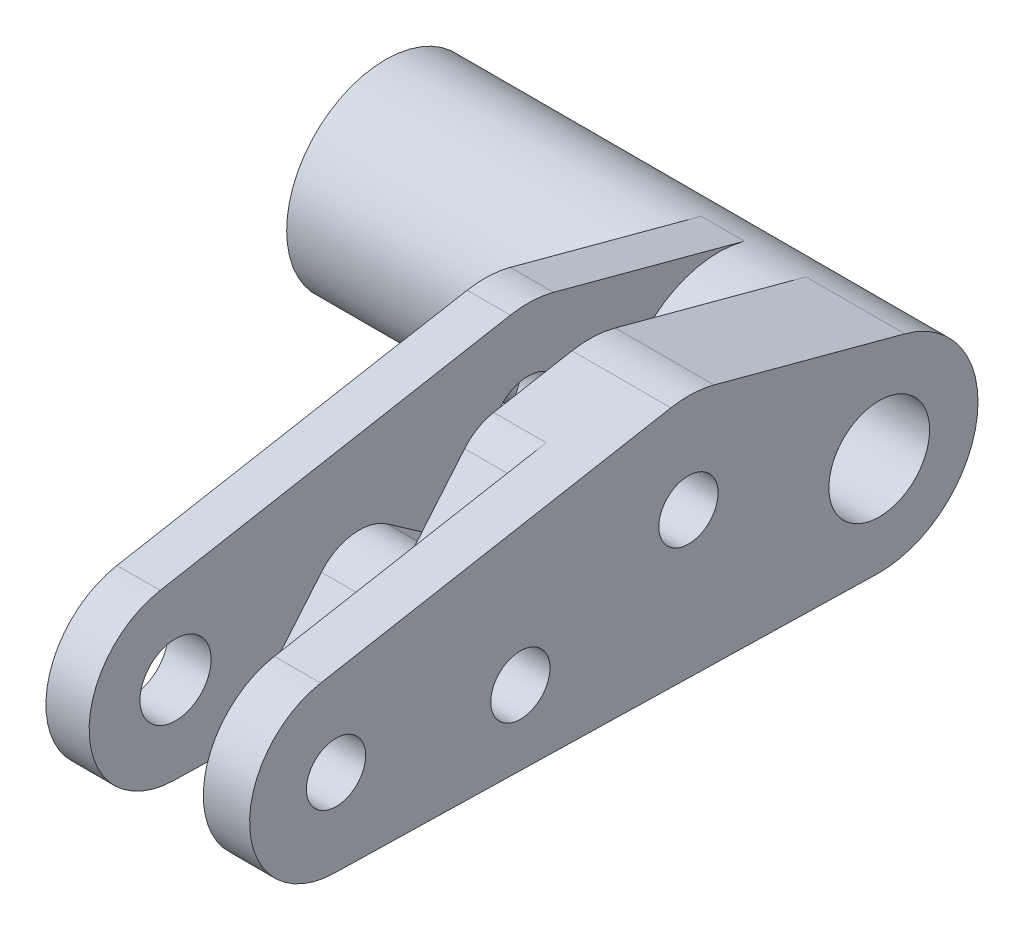
ISO-10303-21;
HEADER;
FILE_DESCRIPTION(('STEP AP214'),'2;1');
FILE_NAME('part.step','',(''),(''),'','','');
FILE_SCHEMA(('AUTOMOTIVE_DESIGN { 1 0 10303 214 1 1 1 1 }'));
ENDSEC;
DATA;
#1=APPLICATION_CONTEXT('core data for automotive mechanical design processes');
#2=APPLICATION_PROTOCOL_DEFINITION('international standard','automotive_design',2000,#1);
#3=PRODUCT_CONTEXT('',#1,'mechanical');
#4=PRODUCT('Part','Part','',(#3));
#5=PRODUCT_RELATED_PRODUCT_CATEGORY('part','',(#4));
#6=PRODUCT_DEFINITION_FORMATION('','',#4);
#7=PRODUCT_DEFINITION_CONTEXT('part definition',#1,'design');
#8=PRODUCT_DEFINITION('design','',#6,#7);
#9=PRODUCT_DEFINITION_SHAPE('','',#8);
#10=(LENGTH_UNIT() NAMED_UNIT(*) SI_UNIT(.MILLI.,.METRE.));
#11=(NAMED_UNIT(*) PLANE_ANGLE_UNIT() SI_UNIT($,.RADIAN.));
#12=(NAMED_UNIT(*) SI_UNIT($,.STERADIAN.) SOLID_ANGLE_UNIT());
#13=UNCERTAINTY_MEASURE_WITH_UNIT(LENGTH_MEASURE(1.E-05),#10,'distance_accuracy_value','');
#14=(GEOMETRIC_REPRESENTATION_CONTEXT(3) GLOBAL_UNCERTAINTY_ASSIGNED_CONTEXT((#13)) GLOBAL_UNIT_ASSIGNED_CONTEXT((#10,
#11,#12)) REPRESENTATION_CONTEXT('',''));
#15=CARTESIAN_POINT('',(0.,0.,0.));
#16=DIRECTION('',(0.,0.,1.));
#17=DIRECTION('',(1.,0.,0.));
#18=AXIS2_PLACEMENT_3D('',#15,#16,#17);
#19=CARTESIAN_POINT('',(-13.096875,-6.34835980883225,0.144318181818181));
#20=DIRECTION('',(0.,-0.999741702178308,0.0227272727272727));
#21=DIRECTION('',(0.,-0.0227272727272727,-0.999741702178308));
#22=AXIS2_PLACEMENT_3D('',#19,#20,#21);
#23=PLANE('',#22);
#24=DIRECTION('',(0.,-0.022727272727273,-0.999741702178308));
#25=VECTOR('',#24,1.);
#26=CARTESIAN_POINT('',(-2.9765625,-5.55481483272822,35.0512784090909));
#27=LINE('',#26,#25);
#28=CARTESIAN_POINT('',(-2.9765625,-5.55481483272822,35.0512784090909));
#29=VERTEX_POINT('',#28);
#30=CARTESIAN_POINT('',(-2.9765625,-5.62468257207032,31.9778919321734));
#31=VERTEX_POINT('',#30);
#32=EDGE_CURVE('E245',#29,#31,#27,.T.);
#33=ORIENTED_EDGE('',*,*,#32,.T.);
#34=DIRECTION('',(1.,0.,0.));
#35=VECTOR('',#34,1.);
#36=CARTESIAN_POINT('',(-10.31875,-5.62468257207032,31.9778919321734));
#37=LINE('',#36,#35);
#38=CARTESIAN_POINT('',(-10.31875,-5.62468257207032,31.9778919321734));
#39=VERTEX_POINT('',#38);
#40=EDGE_CURVE('E273',#39,#31,#37,.T.);
#41=ORIENTED_EDGE('',*,*,#40,.F.);
#42=DIRECTION('',(0.,-0.022727272727273,-0.999741702178308));
#43=VECTOR('',#42,1.);
#44=CARTESIAN_POINT('',(-10.31875,-5.55481483272822,35.0512784090909));
#45=LINE('',#44,#43);
#46=CARTESIAN_POINT('',(-10.31875,-5.55481483272822,35.0512784090909));
#47=VERTEX_POINT('',#46);
#48=EDGE_CURVE('E259',#47,#39,#45,.T.);
#49=ORIENTED_EDGE('',*,*,#48,.F.);
#50=DIRECTION('',(1.,0.,0.));
#51=VECTOR('',#50,1.);
#52=CARTESIAN_POINT('',(-13.096875,-5.55481483272822,35.0512784090909));
#53=LINE('',#52,#51);
#54=CARTESIAN_POINT('',(-13.096875,-5.55481483272822,35.0512784090909));
#55=VERTEX_POINT('',#54);
#56=EDGE_CURVE('E323',#55,#47,#53,.T.);
#57=ORIENTED_EDGE('',*,*,#56,.F.);
#58=DIRECTION('',(0.,-0.0227272727272727,-0.999741702178308));
#59=VECTOR('',#58,1.);
#60=CARTESIAN_POINT('',(-13.096875,-6.34835980883225,0.144318181818181));
#61=LINE('',#60,#59);
#62=CARTESIAN_POINT('',(-13.096875,-6.34835980883225,0.144318181818181));
#63=VERTEX_POINT('',#62);
#64=EDGE_CURVE('E304',#55,#63,#61,.T.);
#65=ORIENTED_EDGE('',*,*,#64,.T.);
#66=DIRECTION('',(1.,0.,0.));
#67=VECTOR('',#66,1.);
#68=CARTESIAN_POINT('',(-13.096875,-6.34835980883225,0.144318181818181));
#69=LINE('',#68,#67);
#70=CARTESIAN_POINT('',(0.,-6.34835980883225,0.144318181818181));
#71=VERTEX_POINT('',#70);
#72=EDGE_CURVE('E199',#63,#71,#69,.T.);
#73=ORIENTED_EDGE('',*,*,#72,.T.);
#74=DIRECTION('',(0.,-0.0227272727272727,-0.999741702178308));
#75=VECTOR('',#74,1.);
#76=CARTESIAN_POINT('',(0.,-6.34835980883225,0.144318181818181));
#77=LINE('',#76,#75);
#78=CARTESIAN_POINT('',(0.,-5.55481483272822,35.0512784090909));
#79=VERTEX_POINT('',#78);
#80=EDGE_CURVE('E184',#79,#71,#77,.T.);
#81=ORIENTED_EDGE('',*,*,#80,.F.);
#82=EDGE_CURVE('E326',#29,#79,#53,.T.);
#83=ORIENTED_EDGE('',*,*,#82,.F.);
#84=EDGE_LOOP('',(#33,#41,#49,#57,#65,#73,#81,#83));
#85=FACE_BOUND('',#84,.T.);
#86=ADVANCED_FACE('F41',(#85),#23,.T.);
#87=CARTESIAN_POINT('',(-13.096875,0.,34.925));
#88=DIRECTION('',(1.,0.,0.));
#89=DIRECTION('',(0.,0.,-1.));
#90=AXIS2_PLACEMENT_3D('',#87,#88,#89);
#91=CYLINDRICAL_SURFACE('',#90,5.55625);
#92=ORIENTED_EDGE('',*,*,#56,.T.);
#93=CARTESIAN_POINT('',(-10.31875,0.,34.925));
#94=DIRECTION('',(1.,0.,0.));
#95=DIRECTION('',(0.,0.,-1.));
#96=AXIS2_PLACEMENT_3D('',#93,#94,#95);
#97=CIRCLE('',#96,5.55625);
#98=CARTESIAN_POINT('',(-10.31875,5.46772752838044,35.9128611936354));
#99=VERTEX_POINT('',#98);
#100=EDGE_CURVE('E257',#99,#47,#97,.T.);
#101=ORIENTED_EDGE('',*,*,#100,.F.);
#102=DIRECTION('',(1.,0.,0.));
#103=VECTOR('',#102,1.);
#104=CARTESIAN_POINT('',(-13.096875,5.46772752838044,35.9128611936354));
#105=LINE('',#104,#103);
#106=CARTESIAN_POINT('',(-13.096875,5.46772752838044,35.9128611936354));
#107=VERTEX_POINT('',#106);
#108=EDGE_CURVE('E327',#107,#99,#105,.T.);
#109=ORIENTED_EDGE('',*,*,#108,.F.);
#110=CARTESIAN_POINT('',(-13.096875,0.,34.925));
#111=DIRECTION('',(1.,0.,0.));
#112=DIRECTION('',(0.,0.,1.));
#113=AXIS2_PLACEMENT_3D('',#110,#111,#112);
#114=CIRCLE('',#113,5.55625);
#115=EDGE_CURVE('E301',#107,#55,#114,.T.);
#116=ORIENTED_EDGE('',*,*,#115,.T.);
#117=EDGE_LOOP('',(#92,#101,#109,#116));
#118=FACE_BOUND('',#117,.T.);
#119=ADVANCED_FACE('F398',(#118),#91,.T.);
#120=CARTESIAN_POINT('',(-13.096875,5.46772752838044,35.9128611936354));
#121=DIRECTION('',(0.,0.984067946615152,0.177792790755526));
#122=DIRECTION('',(0.,-0.177792790755526,0.984067946615152));
#123=AXIS2_PLACEMENT_3D('',#120,#121,#122);
#124=PLANE('',#123);
#125=ORIENTED_EDGE('',*,*,#108,.T.);
#126=DIRECTION('',(0.,-0.177792790755526,0.984067946615152));
#127=VECTOR('',#126,1.);
#128=CARTESIAN_POINT('',(-10.31875,9.53583333380815,13.3962422151688));
#129=LINE('',#128,#127);
#130=CARTESIAN_POINT('',(-10.31875,9.53583333380815,13.3962422151688));
#131=VERTEX_POINT('',#130);
#132=EDGE_CURVE('E255',#131,#99,#129,.T.);
#133=ORIENTED_EDGE('',*,*,#132,.F.);
#134=DIRECTION('',(1.,0.,0.));
#135=VECTOR('',#134,1.);
#136=CARTESIAN_POINT('',(-13.096875,9.53583333380815,13.3962422151688));
#137=LINE('',#136,#135);
#138=CARTESIAN_POINT('',(-13.096875,9.53583333380815,13.3962422151688));
#139=VERTEX_POINT('',#138);
#140=EDGE_CURVE('E331',#139,#131,#137,.T.);
#141=ORIENTED_EDGE('',*,*,#140,.F.);
#142=DIRECTION('',(0.,-0.177792790755526,0.984067946615152));
#143=VECTOR('',#142,1.);
#144=CARTESIAN_POINT('',(-13.096875,5.46772752838044,35.9128611936354));
#145=LINE('',#144,#143);
#146=EDGE_CURVE('E298',#139,#107,#145,.T.);
#147=ORIENTED_EDGE('',*,*,#146,.T.);
#148=EDGE_LOOP('',(#125,#133,#141,#147));
#149=FACE_BOUND('',#148,.T.);
#150=ADVANCED_FACE('F393',(#149),#124,.T.);
#151=CARTESIAN_POINT('',(-13.096875,3.28700187280193,12.2672579938712));
#152=DIRECTION('',(1.,0.,0.));
#153=DIRECTION('',(0.,0.,-1.));
#154=AXIS2_PLACEMENT_3D('',#151,#152,#153);
#155=CYLINDRICAL_SURFACE('',#154,6.35);
#156=ORIENTED_EDGE('',*,*,#140,.T.);
#157=CARTESIAN_POINT('',(-10.31875,3.28700187280193,12.2672579938712));
#158=DIRECTION('',(1.,0.,0.));
#159=DIRECTION('',(0.,0.,-1.));
#160=AXIS2_PLACEMENT_3D('',#157,#158,#159);
#161=CIRCLE('',#160,6.35);
#162=CARTESIAN_POINT('',(-10.31875,9.42063086973753,10.6237570574702));
#163=VERTEX_POINT('',#162);
#164=EDGE_CURVE('E253',#163,#131,#161,.T.);
#165=ORIENTED_EDGE('',*,*,#164,.F.);
#166=DIRECTION('',(1.,0.,0.));
#167=VECTOR('',#166,1.);
#168=CARTESIAN_POINT('',(-13.096875,9.42063086973753,10.6237570574702));
#169=LINE('',#168,#167);
#170=CARTESIAN_POINT('',(-13.096875,9.42063086973753,10.6237570574702));
#171=VERTEX_POINT('',#170);
#172=EDGE_CURVE('E335',#171,#163,#169,.T.);
#173=ORIENTED_EDGE('',*,*,#172,.F.);
#174=CARTESIAN_POINT('',(-13.096875,3.28700187280193,12.2672579938712));
#175=DIRECTION('',(1.,0.,0.));
#176=DIRECTION('',(0.,0.,1.));
#177=AXIS2_PLACEMENT_3D('',#174,#175,#176);
#178=CIRCLE('',#177,6.35);
#179=EDGE_CURVE('E181',#171,#139,#178,.T.);
#180=ORIENTED_EDGE('',*,*,#179,.T.);
#181=EDGE_LOOP('',(#156,#165,#173,#180));
#182=FACE_BOUND('',#181,.T.);
#183=ADVANCED_FACE('F396',(#182),#155,.T.);
#184=CARTESIAN_POINT('',(-13.096875,9.42063086973753,10.6237570574702));
#185=DIRECTION('',(0.,0.96592582628907,-0.258819045102514));
#186=DIRECTION('',(0.,0.258819045102514,0.96592582628907));
#187=AXIS2_PLACEMENT_3D('',#184,#185,#186);
#188=PLANE('',#187);
#189=ORIENTED_EDGE('',*,*,#172,.T.);
#190=DIRECTION('',(0.,0.258819045102514,0.96592582628907));
#191=VECTOR('',#190,1.);
#192=CARTESIAN_POINT('',(-10.31875,6.1336289969356,-1.64350093640097));
#193=LINE('',#192,#191);
#194=CARTESIAN_POINT('',(-10.31875,6.1336289969356,-1.64350093640097));
#195=VERTEX_POINT('',#194);
#196=EDGE_CURVE('E190',#195,#163,#193,.T.);
#197=ORIENTED_EDGE('',*,*,#196,.F.);
#198=DIRECTION('',(1.,0.,0.));
#199=VECTOR('',#198,1.);
#200=CARTESIAN_POINT('',(-13.096875,6.1336289969356,-1.64350093640097));
#201=LINE('',#200,#199);
#202=CARTESIAN_POINT('',(-13.096875,6.13362899693559,-1.64350093640097));
#203=VERTEX_POINT('',#202);
#204=EDGE_CURVE('E188',#203,#195,#201,.T.);
#205=ORIENTED_EDGE('',*,*,#204,.F.);
#206=DIRECTION('',(0.,0.258819045102514,0.96592582628907));
#207=VECTOR('',#206,1.);
#208=CARTESIAN_POINT('',(-13.096875,9.42063086973753,10.6237570574702));
#209=LINE('',#208,#207);
#210=EDGE_CURVE('E172',#203,#171,#209,.T.);
#211=ORIENTED_EDGE('',*,*,#210,.T.);
#212=EDGE_LOOP('',(#189,#197,#205,#211));
#213=FACE_BOUND('',#212,.T.);
#214=ADVANCED_FACE('F189',(#213),#188,.T.);
#215=CARTESIAN_POINT('',(-13.096875,0.,0.));
#216=DIRECTION('',(1.,0.,0.));
#217=DIRECTION('',(0.,0.,-1.));
#218=AXIS2_PLACEMENT_3D('',#215,#216,#217);
#219=CYLINDRICAL_SURFACE('',#218,6.35);
#220=CARTESIAN_POINT('',(0.,0.,0.));
#221=DIRECTION('',(1.,0.,0.));
#222=DIRECTION('',(0.,0.,-1.));
#223=AXIS2_PLACEMENT_3D('',#220,#221,#222);
#224=CIRCLE('',#223,6.35);
#225=CARTESIAN_POINT('',(0.,6.1336289969356,-1.64350093640097));
#226=VERTEX_POINT('',#225);
#227=EDGE_CURVE('E290',#71,#226,#224,.T.);
#228=ORIENTED_EDGE('',*,*,#227,.F.);
#229=ORIENTED_EDGE('',*,*,#72,.F.);
#230=CARTESIAN_POINT('',(-13.096875,0.,0.));
#231=DIRECTION('',(-1.,0.,0.));
#232=DIRECTION('',(0.,0.,1.));
#233=AXIS2_PLACEMENT_3D('',#230,#231,#232);
#234=CIRCLE('',#233,6.35);
#235=EDGE_CURVE('E177',#63,#203,#234,.T.);
#236=ORIENTED_EDGE('',*,*,#235,.T.);
#237=ORIENTED_EDGE('',*,*,#204,.T.);
#238=CARTESIAN_POINT('',(-10.31875,0.,0.));
#239=DIRECTION('',(-1.,0.,0.));
#240=DIRECTION('',(0.,0.,-1.));
#241=AXIS2_PLACEMENT_3D('',#238,#239,#240);
#242=CIRCLE('',#241,6.35);
#243=CARTESIAN_POINT('',(-10.31875,1.64350093640097,6.1336289969356));
#244=VERTEX_POINT('',#243);
#245=EDGE_CURVE('E249',#244,#195,#242,.T.);
#246=ORIENTED_EDGE('',*,*,#245,.F.);
#247=DIRECTION('',(1.,0.,0.));
#248=VECTOR('',#247,1.);
#249=CARTESIAN_POINT('',(-10.31875,1.64350093640097,6.1336289969356));
#250=LINE('',#249,#248);
#251=CARTESIAN_POINT('',(-6.35,1.64350093640097,6.1336289969356));
#252=VERTEX_POINT('',#251);
#253=EDGE_CURVE('E288',#244,#252,#250,.T.);
#254=ORIENTED_EDGE('',*,*,#253,.T.);
#255=CARTESIAN_POINT('',(-6.35,0.,0.));
#256=DIRECTION('',(-1.,0.,0.));
#257=DIRECTION('',(0.,0.,-1.));
#258=AXIS2_PLACEMENT_3D('',#255,#256,#257);
#259=CIRCLE('',#258,6.35);
#260=CARTESIAN_POINT('',(-6.35,6.1336289969356,-1.64350093640097));
#261=VERTEX_POINT('',#260);
#262=EDGE_CURVE('E248',#252,#261,#259,.T.);
#263=ORIENTED_EDGE('',*,*,#262,.T.);
#264=EDGE_CURVE('E194',#261,#226,#201,.T.);
#265=ORIENTED_EDGE('',*,*,#264,.T.);
#266=EDGE_LOOP('',(#228,#229,#236,#237,#246,#254,#263,#265));
#267=FACE_BOUND('',#266,.T.);
#268=CARTESIAN_POINT('',(-31.75,0.,0.));
#269=DIRECTION('',(1.,0.,0.));
#270=DIRECTION('',(0.,0.,-1.));
#271=AXIS2_PLACEMENT_3D('',#268,#269,#270);
#272=CIRCLE('',#271,6.35);
#273=CARTESIAN_POINT('',(-31.75,0.,-6.35));
#274=VERTEX_POINT('',#273);
#275=EDGE_CURVE('E212',#274,#274,#272,.T.);
#276=ORIENTED_EDGE('',*,*,#275,.T.);
#277=EDGE_LOOP('',(#276));
#278=FACE_BOUND('',#277,.T.);
#279=ADVANCED_FACE('F197',(#267,#278),#219,.T.);
#280=CARTESIAN_POINT('',(-2.9765625,0.,34.925));
#281=DIRECTION('',(1.,0.,0.));
#282=DIRECTION('',(0.,0.,-1.));
#283=AXIS2_PLACEMENT_3D('',#280,#281,#282);
#284=CIRCLE('',#283,5.55625);
#285=CARTESIAN_POINT('',(-2.9765625,5.46772752838044,35.9128611936354));
#286=VERTEX_POINT('',#285);
#287=EDGE_CURVE('E242',#286,#29,#284,.T.);
#288=ORIENTED_EDGE('',*,*,#287,.T.);
#289=ORIENTED_EDGE('',*,*,#82,.T.);
#290=CARTESIAN_POINT('',(0.,0.,34.925));
#291=DIRECTION('',(1.,0.,0.));
#292=DIRECTION('',(0.,0.,1.));
#293=AXIS2_PLACEMENT_3D('',#290,#291,#292);
#294=CIRCLE('',#293,5.55625);
#295=CARTESIAN_POINT('',(0.,5.46772752838044,35.9128611936354));
#296=VERTEX_POINT('',#295);
#297=EDGE_CURVE('E317',#296,#79,#294,.T.);
#298=ORIENTED_EDGE('',*,*,#297,.F.);
#299=EDGE_CURVE('E330',#286,#296,#105,.T.);
#300=ORIENTED_EDGE('',*,*,#299,.F.);
#301=EDGE_LOOP('',(#288,#289,#298,#300));
#302=FACE_BOUND('',#301,.T.);
#303=ADVANCED_FACE('F401',(#302),#91,.T.);
#304=DIRECTION('',(0.,-0.177792790755526,0.984067946615152));
#305=VECTOR('',#304,1.);
#306=CARTESIAN_POINT('',(-6.35,9.53583333380815,13.3962422151688));
#307=LINE('',#306,#305);
#308=CARTESIAN_POINT('',(-6.35,9.53583333380815,13.3962422151688));
#309=VERTEX_POINT('',#308);
#310=CARTESIAN_POINT('',(-6.35,8.6245054437357,18.4403644299433));
#311=VERTEX_POINT('',#310);
#312=EDGE_CURVE('E282',#309,#311,#307,.T.);
#313=ORIENTED_EDGE('',*,*,#312,.T.);
#314=DIRECTION('',(1.,0.,0.));
#315=VECTOR('',#314,1.);
#316=CARTESIAN_POINT('',(-2.9765625,8.6245054437357,18.4403644299433));
#317=LINE('',#316,#315);
#318=CARTESIAN_POINT('',(-2.9765625,8.6245054437357,18.4403644299433));
#319=VERTEX_POINT('',#318);
#320=EDGE_CURVE('E347',#311,#319,#317,.T.);
#321=ORIENTED_EDGE('',*,*,#320,.T.);
#322=DIRECTION('',(0.,-0.177792790755526,0.984067946615152));
#323=VECTOR('',#322,1.);
#324=CARTESIAN_POINT('',(-2.9765625,8.42039179913522,19.5701160597174));
#325=LINE('',#324,#323);
#326=EDGE_CURVE('E55',#319,#286,#325,.T.);
#327=ORIENTED_EDGE('',*,*,#326,.T.);
#328=ORIENTED_EDGE('',*,*,#299,.T.);
#329=DIRECTION('',(0.,-0.177792790755526,0.984067946615152));
#330=VECTOR('',#329,1.);
#331=CARTESIAN_POINT('',(0.,5.46772752838044,35.9128611936354));
#332=LINE('',#331,#330);
#333=CARTESIAN_POINT('',(0.,9.53583333380815,13.3962422151688));
#334=VERTEX_POINT('',#333);
#335=EDGE_CURVE('E314',#334,#296,#332,.T.);
#336=ORIENTED_EDGE('',*,*,#335,.F.);
#337=EDGE_CURVE('E334',#309,#334,#137,.T.);
#338=ORIENTED_EDGE('',*,*,#337,.F.);
#339=EDGE_LOOP('',(#313,#321,#327,#328,#336,#338));
#340=FACE_BOUND('',#339,.T.);
#341=ADVANCED_FACE('F406',(#340),#124,.T.);
#342=CARTESIAN_POINT('',(-6.35,3.28700187280193,12.2672579938712));
#343=DIRECTION('',(1.,0.,0.));
#344=DIRECTION('',(0.,0.,-1.));
#345=AXIS2_PLACEMENT_3D('',#342,#343,#344);
#346=CIRCLE('',#345,6.35);
#347=CARTESIAN_POINT('',(-6.35,9.42063086973753,10.6237570574702));
#348=VERTEX_POINT('',#347);
#349=EDGE_CURVE('E279',#348,#309,#346,.T.);
#350=ORIENTED_EDGE('',*,*,#349,.T.);
#351=ORIENTED_EDGE('',*,*,#337,.T.);
#352=CARTESIAN_POINT('',(0.,3.28700187280193,12.2672579938712));
#353=DIRECTION('',(1.,0.,0.));
#354=DIRECTION('',(0.,0.,1.));
#355=AXIS2_PLACEMENT_3D('',#352,#353,#354);
#356=CIRCLE('',#355,6.35);
#357=CARTESIAN_POINT('',(0.,9.42063086973753,10.6237570574702));
#358=VERTEX_POINT('',#357);
#359=EDGE_CURVE('E311',#358,#334,#356,.T.);
#360=ORIENTED_EDGE('',*,*,#359,.F.);
#361=EDGE_CURVE('E193',#348,#358,#169,.T.);
#362=ORIENTED_EDGE('',*,*,#361,.F.);
#363=EDGE_LOOP('',(#350,#351,#360,#362));
#364=FACE_BOUND('',#363,.T.);
#365=ADVANCED_FACE('F380',(#364),#155,.T.);
#366=DIRECTION('',(0.,0.258819045102514,0.96592582628907));
#367=VECTOR('',#366,1.);
#368=CARTESIAN_POINT('',(-6.35,6.1336289969356,-1.64350093640097));
#369=LINE('',#368,#367);
#370=EDGE_CURVE('E276',#261,#348,#369,.T.);
#371=ORIENTED_EDGE('',*,*,#370,.T.);
#372=ORIENTED_EDGE('',*,*,#361,.T.);
#373=DIRECTION('',(0.,0.258819045102514,0.96592582628907));
#374=VECTOR('',#373,1.);
#375=CARTESIAN_POINT('',(0.,9.42063086973753,10.6237570574702));
#376=LINE('',#375,#374);
#377=EDGE_CURVE('E308',#226,#358,#376,.T.);
#378=ORIENTED_EDGE('',*,*,#377,.F.);
#379=ORIENTED_EDGE('',*,*,#264,.F.);
#380=EDGE_LOOP('',(#371,#372,#378,#379));
#381=FACE_BOUND('',#380,.T.);
#382=ADVANCED_FACE('F376',(#381),#188,.T.);
#383=CARTESIAN_POINT('',(-13.096875,0.,0.));
#384=DIRECTION('',(1.,0.,0.));
#385=DIRECTION('',(0.,0.,-1.));
#386=AXIS2_PLACEMENT_3D('',#383,#384,#385);
#387=PLANE('',#386);
#388=CARTESIAN_POINT('',(-13.096875,3.28700187280193,12.2672579938712));
#389=DIRECTION('',(-1.,0.,0.));
#390=DIRECTION('',(0.,0.,1.));
#391=AXIS2_PLACEMENT_3D('',#388,#389,#390);
#392=CIRCLE('',#391,2.286);
#393=CARTESIAN_POINT('',(-13.096875,3.28700187280193,14.5532579938712));
#394=VERTEX_POINT('',#393);
#395=EDGE_CURVE('E705',#394,#394,#392,.T.);
#396=ORIENTED_EDGE('',*,*,#395,.F.);
#397=EDGE_LOOP('',(#396));
#398=FACE_BOUND('',#397,.T.);
#399=CARTESIAN_POINT('',(-13.096875,-1.06336887689837,23.0738547145122));
#400=DIRECTION('',(-1.,0.,0.));
#401=DIRECTION('',(0.,0.,1.));
#402=AXIS2_PLACEMENT_3D('',#399,#400,#401);
#403=CIRCLE('',#402,2.286);
#404=CARTESIAN_POINT('',(-13.096875,-1.06336887689837,25.3598547145122));
#405=VERTEX_POINT('',#404);
#406=EDGE_CURVE('E709',#405,#405,#403,.T.);
#407=ORIENTED_EDGE('',*,*,#406,.F.);
#408=EDGE_LOOP('',(#407));
#409=FACE_BOUND('',#408,.T.);
#410=CARTESIAN_POINT('',(-13.096875,0.,34.925));
#411=DIRECTION('',(-1.,0.,0.));
#412=DIRECTION('',(0.,0.,1.));
#413=AXIS2_PLACEMENT_3D('',#410,#411,#412);
#414=CIRCLE('',#413,2.28599999999999);
#415=CARTESIAN_POINT('',(-13.096875,0.,37.211));
#416=VERTEX_POINT('',#415);
#417=EDGE_CURVE('E210',#416,#416,#414,.T.);
#418=ORIENTED_EDGE('',*,*,#417,.F.);
#419=EDGE_LOOP('',(#418));
#420=FACE_BOUND('',#419,.T.);
#421=ORIENTED_EDGE('',*,*,#235,.F.);
#422=ORIENTED_EDGE('',*,*,#64,.F.);
#423=ORIENTED_EDGE('',*,*,#115,.F.);
#424=ORIENTED_EDGE('',*,*,#146,.F.);
#425=ORIENTED_EDGE('',*,*,#179,.F.);
#426=ORIENTED_EDGE('',*,*,#210,.F.);
#427=EDGE_LOOP('',(#421,#422,#423,#424,#425,#426));
#428=FACE_BOUND('',#427,.T.);
#429=ADVANCED_FACE('F174',(#398,#409,#420,#428),#387,.F.);
#430=CARTESIAN_POINT('',(0.,0.,0.));
#431=DIRECTION('',(1.,0.,0.));
#432=DIRECTION('',(0.,0.,-1.));
#433=AXIS2_PLACEMENT_3D('',#430,#431,#432);
#434=PLANE('',#433);
#435=CARTESIAN_POINT('',(0.,0.,0.));
#436=DIRECTION('',(1.,0.,0.));
#437=DIRECTION('',(0.,0.,-1.));
#438=AXIS2_PLACEMENT_3D('',#435,#436,#437);
#439=CIRCLE('',#438,3.2385);
#440=CARTESIAN_POINT('',(0.,0.,-3.2385));
#441=VERTEX_POINT('',#440);
#442=EDGE_CURVE('E222',#441,#441,#439,.T.);
#443=ORIENTED_EDGE('',*,*,#442,.F.);
#444=EDGE_LOOP('',(#443));
#445=FACE_BOUND('',#444,.T.);
#446=CARTESIAN_POINT('',(0.,-1.06336887689837,23.0738547145122));
#447=DIRECTION('',(1.,0.,0.));
#448=DIRECTION('',(0.,0.,-1.));
#449=AXIS2_PLACEMENT_3D('',#446,#447,#448);
#450=CIRCLE('',#449,1.905);
#451=CARTESIAN_POINT('',(0.,-1.06336887689837,21.1688547145122));
#452=VERTEX_POINT('',#451);
#453=EDGE_CURVE('E221',#452,#452,#450,.T.);
#454=ORIENTED_EDGE('',*,*,#453,.F.);
#455=EDGE_LOOP('',(#454));
#456=FACE_BOUND('',#455,.T.);
#457=CARTESIAN_POINT('',(0.,3.28700187280193,12.2672579938712));
#458=DIRECTION('',(1.,0.,0.));
#459=DIRECTION('',(0.,0.,-1.));
#460=AXIS2_PLACEMENT_3D('',#457,#458,#459);
#461=CIRCLE('',#460,1.905);
#462=CARTESIAN_POINT('',(0.,3.28700187280193,10.3622579938712));
#463=VERTEX_POINT('',#462);
#464=EDGE_CURVE('E229',#463,#463,#461,.T.);
#465=ORIENTED_EDGE('',*,*,#464,.F.);
#466=EDGE_LOOP('',(#465));
#467=FACE_BOUND('',#466,.T.);
#468=CARTESIAN_POINT('',(0.,0.,34.925));
#469=DIRECTION('',(1.,0.,0.));
#470=DIRECTION('',(0.,0.,-1.));
#471=AXIS2_PLACEMENT_3D('',#468,#469,#470);
#472=CIRCLE('',#471,1.905);
#473=CARTESIAN_POINT('',(0.,0.,33.02));
#474=VERTEX_POINT('',#473);
#475=EDGE_CURVE('E226',#474,#474,#472,.T.);
#476=ORIENTED_EDGE('',*,*,#475,.F.);
#477=EDGE_LOOP('',(#476));
#478=FACE_BOUND('',#477,.T.);
#479=ORIENTED_EDGE('',*,*,#227,.T.);
#480=ORIENTED_EDGE('',*,*,#377,.T.);
#481=ORIENTED_EDGE('',*,*,#359,.T.);
#482=ORIENTED_EDGE('',*,*,#335,.T.);
#483=ORIENTED_EDGE('',*,*,#297,.T.);
#484=ORIENTED_EDGE('',*,*,#80,.T.);
#485=EDGE_LOOP('',(#479,#480,#481,#482,#483,#484));
#486=FACE_BOUND('',#485,.T.);
#487=ADVANCED_FACE('F384',(#445,#456,#467,#478,#486),#434,.T.);
#488=CARTESIAN_POINT('',(-10.31875,3.28700187280193,12.2672579938712));
#489=DIRECTION('',(1.,0.,0.));
#490=DIRECTION('',(0.,0.,-1.));
#491=AXIS2_PLACEMENT_3D('',#488,#489,#490);
#492=CYLINDRICAL_SURFACE('',#491,6.35);
#493=CARTESIAN_POINT('',(-6.35,3.28700187280193,12.2672579938712));
#494=DIRECTION('',(1.,0.,0.));
#495=DIRECTION('',(0.,0.,1.));
#496=AXIS2_PLACEMENT_3D('',#493,#494,#495);
#497=CIRCLE('',#496,6.35);
#498=CARTESIAN_POINT('',(-6.35,-1.91461360843319,15.9094683647003));
#499=VERTEX_POINT('',#498);
#500=EDGE_CURVE('E251',#499,#252,#497,.T.);
#501=ORIENTED_EDGE('',*,*,#500,.T.);
#502=ORIENTED_EDGE('',*,*,#253,.F.);
#503=CARTESIAN_POINT('',(-10.31875,3.28700187280193,12.2672579938712));
#504=DIRECTION('',(1.,0.,0.));
#505=DIRECTION('',(0.,0.,1.));
#506=AXIS2_PLACEMENT_3D('',#503,#504,#505);
#507=CIRCLE('',#506,6.35);
#508=CARTESIAN_POINT('',(-10.31875,-1.91461360843319,15.9094683647003));
#509=VERTEX_POINT('',#508);
#510=EDGE_CURVE('E270',#509,#244,#507,.T.);
#511=ORIENTED_EDGE('',*,*,#510,.F.);
#512=DIRECTION('',(1.,0.,0.));
#513=VECTOR('',#512,1.);
#514=CARTESIAN_POINT('',(-10.31875,-1.91461360843319,15.9094683647003));
#515=LINE('',#514,#513);
#516=EDGE_CURVE('E291',#509,#499,#515,.T.);
#517=ORIENTED_EDGE('',*,*,#516,.T.);
#518=EDGE_LOOP('',(#501,#502,#511,#517));
#519=FACE_BOUND('',#518,.T.);
#520=ADVANCED_FACE('F371',(#519),#492,.F.);
#521=CARTESIAN_POINT('',(-10.31875,-1.91461360843319,15.9094683647003));
#522=DIRECTION('',(0.,-0.819152044288995,0.573576436351041));
#523=DIRECTION('',(0.,-0.573576436351041,-0.819152044288995));
#524=AXIS2_PLACEMENT_3D('',#521,#522,#523);
#525=PLANE('',#524);
#526=DIRECTION('',(0.,-0.573576436351041,-0.819152044288995));
#527=VECTOR('',#526,1.);
#528=CARTESIAN_POINT('',(-10.31875,-1.91461360843319,15.9094683647003));
#529=LINE('',#528,#527);
#530=CARTESIAN_POINT('',(-10.31875,1.85617448926182,21.2947118702704));
#531=VERTEX_POINT('',#530);
#532=EDGE_CURVE('E268',#531,#509,#529,.T.);
#533=ORIENTED_EDGE('',*,*,#532,.F.);
#534=DIRECTION('',(1.,0.,0.));
#535=VECTOR('',#534,1.);
#536=CARTESIAN_POINT('',(-10.31875,1.85617448926182,21.2947118702704));
#537=LINE('',#536,#535);
#538=CARTESIAN_POINT('',(-6.35,1.85617448926182,21.2947118702704));
#539=VERTEX_POINT('',#538);
#540=EDGE_CURVE('E201',#531,#539,#537,.T.);
#541=ORIENTED_EDGE('',*,*,#540,.T.);
#542=DIRECTION('',(0.,-0.573576436351041,-0.819152044288995));
#543=VECTOR('',#542,1.);
#544=CARTESIAN_POINT('',(-6.35,-1.91461360843319,15.9094683647003));
#545=LINE('',#544,#543);
#546=EDGE_CURVE('E284',#539,#499,#545,.T.);
#547=ORIENTED_EDGE('',*,*,#546,.T.);
#548=ORIENTED_EDGE('',*,*,#516,.F.);
#549=EDGE_LOOP('',(#533,#541,#547,#548));
#550=FACE_BOUND('',#549,.T.);
#551=ADVANCED_FACE('F363',(#550),#525,.F.);
#552=CARTESIAN_POINT('',(-10.31875,3.52490994182194,23.677913080624));
#553=DIRECTION('',(0.,-0.642787609686544,-0.766044443118974));
#554=DIRECTION('',(0.,0.766044443118974,-0.642787609686544));
#555=AXIS2_PLACEMENT_3D('',#552,#553,#554);
#556=PLANE('',#555);
#557=DIRECTION('',(0.,0.766044443118975,-0.642787609686543));
#558=VECTOR('',#557,1.);
#559=CARTESIAN_POINT('',(-6.35,13.1155040654662,15.6304490887031));
#560=LINE('',#559,#558);
#561=CARTESIAN_POINT('',(-6.35,1.29621740939904,25.5480081625877));
#562=VERTEX_POINT('',#561);
#563=CARTESIAN_POINT('',(-6.35,7.54094037398738,20.3080634261973));
#564=VERTEX_POINT('',#563);
#565=EDGE_CURVE('E202',#562,#564,#560,.T.);
#566=ORIENTED_EDGE('',*,*,#565,.F.);
#567=DIRECTION('',(1.,0.,0.));
#568=VECTOR('',#567,1.);
#569=CARTESIAN_POINT('',(-10.31875,1.29621740939904,25.5480081625877));
#570=LINE('',#569,#568);
#571=CARTESIAN_POINT('',(-10.31875,1.29621740939904,25.5480081625877));
#572=VERTEX_POINT('',#571);
#573=EDGE_CURVE('E345',#562,#572,#570,.F.);
#574=ORIENTED_EDGE('',*,*,#573,.T.);
#575=DIRECTION('',(0.,0.766044443118974,-0.642787609686544));
#576=VECTOR('',#575,1.);
#577=CARTESIAN_POINT('',(-10.31875,3.52490994182194,23.677913080624));
#578=LINE('',#577,#576);
#579=CARTESIAN_POINT('',(-10.31875,-4.08170132150955,30.0606177861945));
#580=VERTEX_POINT('',#579);
#581=EDGE_CURVE('E265',#580,#572,#578,.T.);
#582=ORIENTED_EDGE('',*,*,#581,.F.);
#583=DIRECTION('',(1.,0.,0.));
#584=VECTOR('',#583,1.);
#585=CARTESIAN_POINT('',(-10.31875,-4.08170132150955,30.0606177861945));
#586=LINE('',#585,#584);
#587=CARTESIAN_POINT('',(-2.9765625,-4.08170132150955,30.0606177861945));
#588=VERTEX_POINT('',#587);
#589=EDGE_CURVE('E294',#580,#588,#586,.T.);
#590=ORIENTED_EDGE('',*,*,#589,.T.);
#591=DIRECTION('',(0.,0.766044443118975,-0.642787609686543));
#592=VECTOR('',#591,1.);
#593=CARTESIAN_POINT('',(-2.9765625,-4.08170132150955,30.0606177861945));
#594=LINE('',#593,#592);
#595=CARTESIAN_POINT('',(-2.9765625,7.54094037398738,20.3080634261973));
#596=VERTEX_POINT('',#595);
#597=EDGE_CURVE('E237',#588,#596,#594,.T.);
#598=ORIENTED_EDGE('',*,*,#597,.T.);
#599=DIRECTION('',(1.,0.,0.));
#600=VECTOR('',#599,1.);
#601=CARTESIAN_POINT('',(-6.35,7.54094037398737,20.3080634261973));
#602=LINE('',#601,#600);
#603=EDGE_CURVE('E205',#596,#564,#602,.F.);
#604=ORIENTED_EDGE('',*,*,#603,.T.);
#605=EDGE_LOOP('',(#566,#574,#582,#590,#598,#604));
#606=FACE_BOUND('',#605,.T.);
#607=ADVANCED_FACE('F427',(#606),#556,.F.);
#608=CARTESIAN_POINT('',(-10.31875,0.,34.925));
#609=DIRECTION('',(1.,0.,0.));
#610=DIRECTION('',(0.,0.,-1.));
#611=AXIS2_PLACEMENT_3D('',#608,#609,#610);
#612=CYLINDRICAL_SURFACE('',#611,6.35);
#613=CARTESIAN_POINT('',(-2.9765625,0.,34.925));
#614=DIRECTION('',(1.,0.,0.));
#615=DIRECTION('',(0.,0.,-1.));
#616=AXIS2_PLACEMENT_3D('',#613,#614,#615);
#617=CIRCLE('',#616,6.35);
#618=EDGE_CURVE('E234',#31,#588,#617,.T.);
#619=ORIENTED_EDGE('',*,*,#618,.T.);
#620=ORIENTED_EDGE('',*,*,#589,.F.);
#621=CARTESIAN_POINT('',(-10.31875,0.,34.925));
#622=DIRECTION('',(1.,0.,0.));
#623=DIRECTION('',(0.,0.,1.));
#624=AXIS2_PLACEMENT_3D('',#621,#622,#623);
#625=CIRCLE('',#624,6.35);
#626=EDGE_CURVE('E262',#39,#580,#625,.T.);
#627=ORIENTED_EDGE('',*,*,#626,.F.);
#628=ORIENTED_EDGE('',*,*,#40,.T.);
#629=EDGE_LOOP('',(#619,#620,#627,#628));
#630=FACE_BOUND('',#629,.T.);
#631=ADVANCED_FACE('F429',(#630),#612,.F.);
#632=CARTESIAN_POINT('',(-10.31875,0.,0.));
#633=DIRECTION('',(1.,0.,0.));
#634=DIRECTION('',(0.,0.,-1.));
#635=AXIS2_PLACEMENT_3D('',#632,#633,#634);
#636=PLANE('',#635);
#637=CARTESIAN_POINT('',(-10.31875,3.28700187280193,12.2672579938712));
#638=DIRECTION('',(1.,0.,0.));
#639=DIRECTION('',(0.,0.,-1.));
#640=AXIS2_PLACEMENT_3D('',#637,#638,#639);
#641=CIRCLE('',#640,2.286);
#642=CARTESIAN_POINT('',(-10.31875,3.28700187280193,9.98125799387119));
#643=VERTEX_POINT('',#642);
#644=EDGE_CURVE('E342',#643,#643,#641,.F.);
#645=ORIENTED_EDGE('',*,*,#644,.T.);
#646=EDGE_LOOP('',(#645));
#647=FACE_BOUND('',#646,.T.);
#648=CARTESIAN_POINT('',(-10.31875,0.,34.925));
#649=DIRECTION('',(1.,0.,0.));
#650=DIRECTION('',(0.,0.,-1.));
#651=AXIS2_PLACEMENT_3D('',#648,#649,#650);
#652=CIRCLE('',#651,2.28599999999999);
#653=CARTESIAN_POINT('',(-10.31875,0.,32.639));
#654=VERTEX_POINT('',#653);
#655=EDGE_CURVE('E716',#654,#654,#652,.F.);
#656=ORIENTED_EDGE('',*,*,#655,.T.);
#657=EDGE_LOOP('',(#656));
#658=FACE_BOUND('',#657,.T.);
#659=ORIENTED_EDGE('',*,*,#245,.T.);
#660=ORIENTED_EDGE('',*,*,#196,.T.);
#661=ORIENTED_EDGE('',*,*,#164,.T.);
#662=ORIENTED_EDGE('',*,*,#132,.T.);
#663=ORIENTED_EDGE('',*,*,#100,.T.);
#664=ORIENTED_EDGE('',*,*,#48,.T.);
#665=ORIENTED_EDGE('',*,*,#626,.T.);
#666=ORIENTED_EDGE('',*,*,#581,.T.);
#667=CARTESIAN_POINT('',(-10.31875,-0.744633251355739,23.1158170556849));
#668=DIRECTION('',(1.,0.,0.));
#669=DIRECTION('',(0.,0.,-1.));
#670=AXIS2_PLACEMENT_3D('',#667,#668,#669);
#671=CIRCLE('',#670,3.175);
#672=EDGE_CURVE('E49',#572,#531,#671,.F.);
#673=ORIENTED_EDGE('',*,*,#672,.T.);
#674=ORIENTED_EDGE('',*,*,#532,.T.);
#675=ORIENTED_EDGE('',*,*,#510,.T.);
#676=EDGE_LOOP('',(#659,#660,#661,#662,#663,#664,#665,#666,#673,#674,#675));
#677=FACE_BOUND('',#676,.T.);
#678=ADVANCED_FACE('F356',(#647,#658,#677),#636,.T.);
#679=CARTESIAN_POINT('',(-6.35,0.,0.));
#680=DIRECTION('',(1.,0.,0.));
#681=DIRECTION('',(0.,0.,-1.));
#682=AXIS2_PLACEMENT_3D('',#679,#680,#681);
#683=PLANE('',#682);
#684=CARTESIAN_POINT('',(-6.35,3.28700187280193,12.2672579938712));
#685=DIRECTION('',(1.,0.,0.));
#686=DIRECTION('',(0.,0.,-1.));
#687=AXIS2_PLACEMENT_3D('',#684,#685,#686);
#688=CIRCLE('',#687,1.905);
#689=CARTESIAN_POINT('',(-6.35,3.28700187280193,10.3622579938712));
#690=VERTEX_POINT('',#689);
#691=EDGE_CURVE('E238',#690,#690,#688,.T.);
#692=ORIENTED_EDGE('',*,*,#691,.T.);
#693=EDGE_LOOP('',(#692));
#694=FACE_BOUND('',#693,.T.);
#695=ORIENTED_EDGE('',*,*,#565,.T.);
#696=CARTESIAN_POINT('',(-6.35,5.5000897132326,17.8758723192945));
#697=DIRECTION('',(1.,0.,0.));
#698=DIRECTION('',(0.,0.,-1.));
#699=AXIS2_PLACEMENT_3D('',#696,#697,#698);
#700=CIRCLE('',#699,3.175);
#701=EDGE_CURVE('E63',#564,#311,#700,.F.);
#702=ORIENTED_EDGE('',*,*,#701,.T.);
#703=ORIENTED_EDGE('',*,*,#312,.F.);
#704=ORIENTED_EDGE('',*,*,#349,.F.);
#705=ORIENTED_EDGE('',*,*,#370,.F.);
#706=ORIENTED_EDGE('',*,*,#262,.F.);
#707=ORIENTED_EDGE('',*,*,#500,.F.);
#708=ORIENTED_EDGE('',*,*,#546,.F.);
#709=CARTESIAN_POINT('',(-6.35,-0.744633251355739,23.1158170556849));
#710=DIRECTION('',(1.,0.,0.));
#711=DIRECTION('',(0.,0.,-1.));
#712=AXIS2_PLACEMENT_3D('',#709,#710,#711);
#713=CIRCLE('',#712,3.175);
#714=EDGE_CURVE('E351',#539,#562,#713,.T.);
#715=ORIENTED_EDGE('',*,*,#714,.T.);
#716=EDGE_LOOP('',(#695,#702,#703,#704,#705,#706,#707,#708,#715));
#717=FACE_BOUND('',#716,.T.);
#718=ADVANCED_FACE('F367',(#694,#717),#683,.F.);
#719=CARTESIAN_POINT('',(-2.9765625,0.,34.925));
#720=DIRECTION('',(1.,0.,0.));
#721=DIRECTION('',(0.,0.,-1.));
#722=AXIS2_PLACEMENT_3D('',#719,#720,#721);
#723=PLANE('',#722);
#724=CARTESIAN_POINT('',(-2.9765625,0.,34.925));
#725=DIRECTION('',(1.,0.,0.));
#726=DIRECTION('',(0.,0.,-1.));
#727=AXIS2_PLACEMENT_3D('',#724,#725,#726);
#728=CIRCLE('',#727,1.905);
#729=CARTESIAN_POINT('',(-2.9765625,0.,33.02));
#730=VERTEX_POINT('',#729);
#731=EDGE_CURVE('E225',#730,#730,#728,.T.);
#732=ORIENTED_EDGE('',*,*,#731,.T.);
#733=EDGE_LOOP('',(#732));
#734=FACE_BOUND('',#733,.T.);
#735=ORIENTED_EDGE('',*,*,#618,.F.);
#736=ORIENTED_EDGE('',*,*,#32,.F.);
#737=ORIENTED_EDGE('',*,*,#287,.F.);
#738=ORIENTED_EDGE('',*,*,#326,.F.);
#739=CARTESIAN_POINT('',(-2.9765625,5.5000897132326,17.8758723192945));
#740=DIRECTION('',(1.,0.,0.));
#741=DIRECTION('',(0.,0.,-1.));
#742=AXIS2_PLACEMENT_3D('',#739,#740,#741);
#743=CIRCLE('',#742,3.175);
#744=EDGE_CURVE('E11',#319,#596,#743,.T.);
#745=ORIENTED_EDGE('',*,*,#744,.T.);
#746=ORIENTED_EDGE('',*,*,#597,.F.);
#747=EDGE_LOOP('',(#735,#736,#737,#738,#745,#746));
#748=FACE_BOUND('',#747,.T.);
#749=ADVANCED_FACE('F421',(#734,#748),#723,.F.);
#750=CARTESIAN_POINT('',(-13.096875,0.,34.925));
#751=DIRECTION('',(1.,0.,0.));
#752=DIRECTION('',(0.,0.,-1.));
#753=AXIS2_PLACEMENT_3D('',#750,#751,#752);
#754=CYLINDRICAL_SURFACE('',#753,1.905);
#755=ORIENTED_EDGE('',*,*,#475,.T.);
#756=EDGE_LOOP('',(#755));
#757=FACE_BOUND('',#756,.T.);
#758=ORIENTED_EDGE('',*,*,#731,.F.);
#759=EDGE_LOOP('',(#758));
#760=FACE_BOUND('',#759,.T.);
#761=ADVANCED_FACE('F458',(#757,#760),#754,.F.);
#762=CARTESIAN_POINT('',(-13.096875,3.28700187280193,12.2672579938712));
#763=DIRECTION('',(1.,0.,0.));
#764=DIRECTION('',(0.,0.,-1.));
#765=AXIS2_PLACEMENT_3D('',#762,#763,#764);
#766=CYLINDRICAL_SURFACE('',#765,1.905);
#767=ORIENTED_EDGE('',*,*,#464,.T.);
#768=EDGE_LOOP('',(#767));
#769=FACE_BOUND('',#768,.T.);
#770=ORIENTED_EDGE('',*,*,#691,.F.);
#771=EDGE_LOOP('',(#770));
#772=FACE_BOUND('',#771,.T.);
#773=ADVANCED_FACE('F460',(#769,#772),#766,.F.);
#774=CARTESIAN_POINT('',(-13.096875,-1.06336887689837,23.0738547145122));
#775=DIRECTION('',(1.,0.,0.));
#776=DIRECTION('',(0.,0.,-1.));
#777=AXIS2_PLACEMENT_3D('',#774,#775,#776);
#778=CYLINDRICAL_SURFACE('',#777,1.905);
#779=CARTESIAN_POINT('',(-10.31875,-1.06336887689837,23.0738547145122));
#780=DIRECTION('',(1.,0.,0.));
#781=DIRECTION('',(0.,0.,-1.));
#782=AXIS2_PLACEMENT_3D('',#779,#780,#781);
#783=CIRCLE('',#782,1.905);
#784=CARTESIAN_POINT('',(-10.31875,-1.06336887689837,21.1688547145122));
#785=VERTEX_POINT('',#784);
#786=EDGE_CURVE('E217',#785,#785,#783,.F.);
#787=ORIENTED_EDGE('',*,*,#786,.T.);
#788=EDGE_LOOP('',(#787));
#789=FACE_BOUND('',#788,.T.);
#790=ORIENTED_EDGE('',*,*,#453,.T.);
#791=EDGE_LOOP('',(#790));
#792=FACE_BOUND('',#791,.T.);
#793=ADVANCED_FACE('F519',(#789,#792),#778,.F.);
#794=CARTESIAN_POINT('',(-13.096875,0.,0.));
#795=DIRECTION('',(1.,0.,0.));
#796=DIRECTION('',(0.,0.,-1.));
#797=AXIS2_PLACEMENT_3D('',#794,#795,#796);
#798=CYLINDRICAL_SURFACE('',#797,3.2385);
#799=ORIENTED_EDGE('',*,*,#442,.T.);
#800=EDGE_LOOP('',(#799));
#801=FACE_BOUND('',#800,.T.);
#802=CARTESIAN_POINT('',(-31.75,0.,0.));
#803=DIRECTION('',(1.,0.,0.));
#804=DIRECTION('',(0.,0.,-1.));
#805=AXIS2_PLACEMENT_3D('',#802,#803,#804);
#806=CIRCLE('',#805,3.2385);
#807=CARTESIAN_POINT('',(-31.75,0.,-3.2385));
#808=VERTEX_POINT('',#807);
#809=EDGE_CURVE('E216',#808,#808,#806,.T.);
#810=ORIENTED_EDGE('',*,*,#809,.F.);
#811=EDGE_LOOP('',(#810));
#812=FACE_BOUND('',#811,.T.);
#813=ADVANCED_FACE('F527',(#801,#812),#798,.F.);
#814=CARTESIAN_POINT('',(-31.75,-26.4231337847744,-25.9380608564333));
#815=DIRECTION('',(1.,0.,0.));
#816=DIRECTION('',(0.,0.,-1.));
#817=AXIS2_PLACEMENT_3D('',#814,#815,#816);
#818=PLANE('',#817);
#819=ORIENTED_EDGE('',*,*,#809,.T.);
#820=EDGE_LOOP('',(#819));
#821=FACE_BOUND('',#820,.T.);
#822=ORIENTED_EDGE('',*,*,#275,.F.);
#823=EDGE_LOOP('',(#822));
#824=FACE_BOUND('',#823,.T.);
#825=ADVANCED_FACE('F536',(#821,#824),#818,.F.);
#826=CARTESIAN_POINT('',(-10.31875,0.,0.));
#827=DIRECTION('',(1.,0.,0.));
#828=DIRECTION('',(0.,0.,-1.));
#829=AXIS2_PLACEMENT_3D('',#826,#827,#828);
#830=PLANE('',#829);
#831=CARTESIAN_POINT('',(-10.31875,-1.06336887689837,23.0738547145122));
#832=DIRECTION('',(1.,0.,0.));
#833=DIRECTION('',(0.,0.,-1.));
#834=AXIS2_PLACEMENT_3D('',#831,#832,#833);
#835=CIRCLE('',#834,2.286);
#836=CARTESIAN_POINT('',(-10.31875,-1.06336887689837,20.7878547145122));
#837=VERTEX_POINT('',#836);
#838=EDGE_CURVE('E712',#837,#837,#835,.F.);
#839=ORIENTED_EDGE('',*,*,#838,.T.);
#840=EDGE_LOOP('',(#839));
#841=FACE_BOUND('',#840,.T.);
#842=ORIENTED_EDGE('',*,*,#786,.F.);
#843=EDGE_LOOP('',(#842));
#844=FACE_BOUND('',#843,.T.);
#845=ADVANCED_FACE('F547',(#841,#844),#830,.F.);
#846=CARTESIAN_POINT('',(-3.85296559283021,-1.06336887689837,23.0738547145122));
#847=DIRECTION('',(-1.,0.,0.));
#848=DIRECTION('',(0.,0.,1.));
#849=AXIS2_PLACEMENT_3D('',#846,#847,#848);
#850=CYLINDRICAL_SURFACE('',#849,2.286);
#851=ORIENTED_EDGE('',*,*,#406,.T.);
#852=EDGE_LOOP('',(#851));
#853=FACE_BOUND('',#852,.T.);
#854=ORIENTED_EDGE('',*,*,#838,.F.);
#855=EDGE_LOOP('',(#854));
#856=FACE_BOUND('',#855,.T.);
#857=ADVANCED_FACE('F556',(#853,#856),#850,.F.);
#858=CARTESIAN_POINT('',(-3.85296559283021,0.,34.925));
#859=DIRECTION('',(-1.,0.,0.));
#860=DIRECTION('',(0.,0.,1.));
#861=AXIS2_PLACEMENT_3D('',#858,#859,#860);
#862=CYLINDRICAL_SURFACE('',#861,2.28599999999999);
#863=ORIENTED_EDGE('',*,*,#417,.T.);
#864=EDGE_LOOP('',(#863));
#865=FACE_BOUND('',#864,.T.);
#866=ORIENTED_EDGE('',*,*,#655,.F.);
#867=EDGE_LOOP('',(#866));
#868=FACE_BOUND('',#867,.T.);
#869=ADVANCED_FACE('F565',(#865,#868),#862,.F.);
#870=CARTESIAN_POINT('',(-3.85296559283021,3.28700187280193,12.2672579938712));
#871=DIRECTION('',(-1.,0.,0.));
#872=DIRECTION('',(0.,0.,1.));
#873=AXIS2_PLACEMENT_3D('',#870,#871,#872);
#874=CYLINDRICAL_SURFACE('',#873,2.286);
#875=ORIENTED_EDGE('',*,*,#395,.T.);
#876=EDGE_LOOP('',(#875));
#877=FACE_BOUND('',#876,.T.);
#878=ORIENTED_EDGE('',*,*,#644,.F.);
#879=EDGE_LOOP('',(#878));
#880=FACE_BOUND('',#879,.T.);
#881=ADVANCED_FACE('F574',(#877,#880),#874,.F.);
#882=CARTESIAN_POINT('',(-10.31875,-0.744633251355739,23.1158170556849));
#883=DIRECTION('',(1.,0.,0.));
#884=DIRECTION('',(0.,0.,-1.));
#885=AXIS2_PLACEMENT_3D('',#882,#883,#884);
#886=CYLINDRICAL_SURFACE('',#885,3.175);
#887=ORIENTED_EDGE('',*,*,#672,.F.);
#888=ORIENTED_EDGE('',*,*,#573,.F.);
#889=ORIENTED_EDGE('',*,*,#714,.F.);
#890=ORIENTED_EDGE('',*,*,#540,.F.);
#891=EDGE_LOOP('',(#887,#888,#889,#890));
#892=FACE_BOUND('',#891,.T.);
#893=ADVANCED_FACE('F366',(#892),#886,.T.);
#894=CARTESIAN_POINT('',(-13.096875,5.5000897132326,17.8758723192945));
#895=DIRECTION('',(-1.,0.,0.));
#896=DIRECTION('',(0.,0.,1.));
#897=AXIS2_PLACEMENT_3D('',#894,#895,#896);
#898=CYLINDRICAL_SURFACE('',#897,3.175);
#899=ORIENTED_EDGE('',*,*,#701,.F.);
#900=ORIENTED_EDGE('',*,*,#603,.F.);
#901=ORIENTED_EDGE('',*,*,#744,.F.);
#902=ORIENTED_EDGE('',*,*,#320,.F.);
#903=EDGE_LOOP('',(#899,#900,#901,#902));
#904=FACE_BOUND('',#903,.T.);
#905=ADVANCED_FACE('F43',(#904),#898,.T.);
#906=CLOSED_SHELL('',(#86,#119,#150,#183,#214,#279,#303,#341,#365,#382,#429,#487,#520,#551,#607,
#631,#678,#718,#749,#761,#773,#793,#813,#825,#845,#857,#869,#881,#893,#905));
#907=MANIFOLD_SOLID_BREP('B2',#906);
#908=ADVANCED_BREP_SHAPE_REPRESENTATION('',(#18,#907),#14);
#909=SHAPE_DEFINITION_REPRESENTATION(#9,#908);
ENDSEC;
END-ISO-10303-21;
